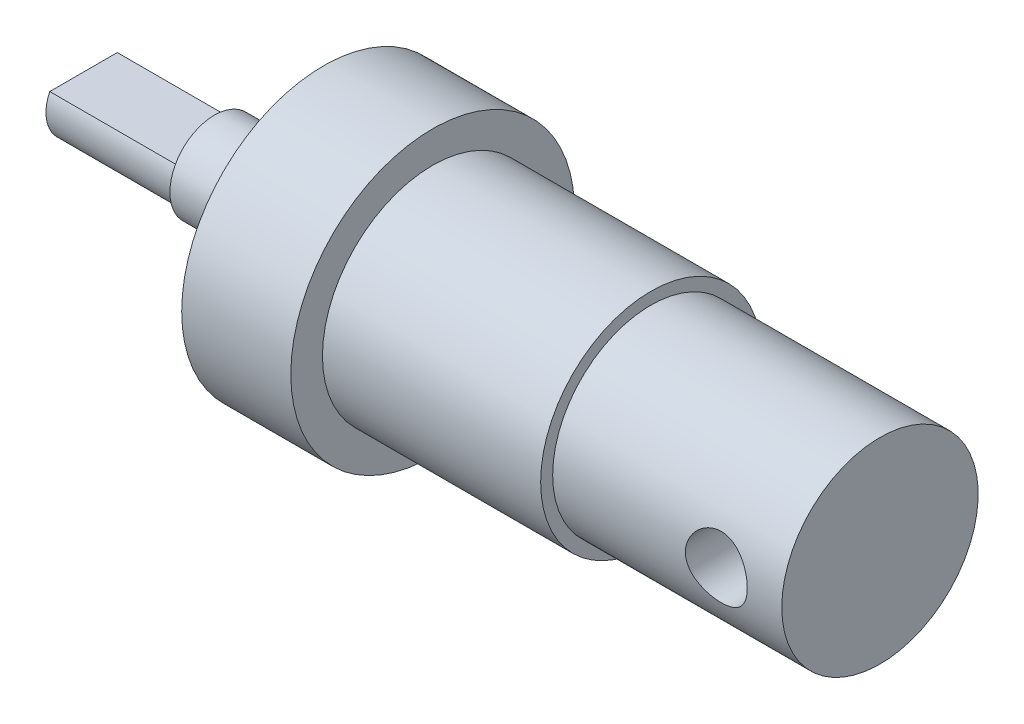
ISO-10303-21;
HEADER;
FILE_DESCRIPTION(('STEP AP214'),'2;1');
FILE_NAME('part.step','',(''),(''),'','','');
FILE_SCHEMA(('AUTOMOTIVE_DESIGN { 1 0 10303 214 1 1 1 1 }'));
ENDSEC;
DATA;
#1=APPLICATION_CONTEXT('core data for automotive mechanical design processes');
#2=APPLICATION_PROTOCOL_DEFINITION('international standard','automotive_design',2000,#1);
#3=PRODUCT_CONTEXT('',#1,'mechanical');
#4=PRODUCT('Part','Part','',(#3));
#5=PRODUCT_RELATED_PRODUCT_CATEGORY('part','',(#4));
#6=PRODUCT_DEFINITION_FORMATION('','',#4);
#7=PRODUCT_DEFINITION_CONTEXT('part definition',#1,'design');
#8=PRODUCT_DEFINITION('design','',#6,#7);
#9=PRODUCT_DEFINITION_SHAPE('','',#8);
#10=(LENGTH_UNIT() NAMED_UNIT(*) SI_UNIT(.MILLI.,.METRE.));
#11=(NAMED_UNIT(*) PLANE_ANGLE_UNIT() SI_UNIT($,.RADIAN.));
#12=(NAMED_UNIT(*) SI_UNIT($,.STERADIAN.) SOLID_ANGLE_UNIT());
#13=UNCERTAINTY_MEASURE_WITH_UNIT(LENGTH_MEASURE(1.E-05),#10,'distance_accuracy_value','');
#14=(GEOMETRIC_REPRESENTATION_CONTEXT(3) GLOBAL_UNCERTAINTY_ASSIGNED_CONTEXT((#13)) GLOBAL_UNIT_ASSIGNED_CONTEXT((#10,
#11,#12)) REPRESENTATION_CONTEXT('',''));
#15=CARTESIAN_POINT('',(0.,0.,0.));
#16=DIRECTION('',(0.,0.,1.));
#17=DIRECTION('',(1.,0.,0.));
#18=AXIS2_PLACEMENT_3D('',#15,#16,#17);
#19=CARTESIAN_POINT('',(-5.,0.,0.));
#20=DIRECTION('',(-1.,0.,0.));
#21=DIRECTION('',(0.,0.,1.));
#22=AXIS2_PLACEMENT_3D('',#19,#20,#21);
#23=CYLINDRICAL_SURFACE('',#22,4.5);
#24=CARTESIAN_POINT('',(16.588256828574,-1.09764286276754,4.36407838447224));
#25=CARTESIAN_POINT('',(16.5270833845499,-1.04617330759767,4.3770231438269));
#26=CARTESIAN_POINT('',(16.4702957225923,-0.989555024817385,4.39029354434856));
#27=CARTESIAN_POINT('',(16.3669482948807,-0.867467578833485,4.41603753323898));
#28=CARTESIAN_POINT('',(16.3203910086217,-0.801996276156327,4.42851092792226));
#29=CARTESIAN_POINT('',(16.2387721071905,-0.663768969664404,4.45132759737578));
#30=CARTESIAN_POINT('',(16.2037254457204,-0.591003648861528,4.46166809482042));
#31=CARTESIAN_POINT('',(16.1463734983666,-0.440249431524472,4.47905430840141));
#32=CARTESIAN_POINT('',(16.1240640621078,-0.362262245779606,4.48610109764383));
#33=CARTESIAN_POINT('',(16.0934520755528,-0.205622706533306,4.49596502276719));
#34=CARTESIAN_POINT('',(16.0847710562777,-0.127051613127193,4.49889619655373));
#35=CARTESIAN_POINT('',(16.08056352236,0.0304814895061291,4.50058568922495));
#36=CARTESIAN_POINT('',(16.0850348574784,0.109443432727423,4.49934469020088));
#37=CARTESIAN_POINT('',(16.106621519285,0.262909411636466,4.49294972792596));
#38=CARTESIAN_POINT('',(16.1233360822228,0.337475597910401,4.48791964963629));
#39=CARTESIAN_POINT('',(16.1683855120653,0.482700819526159,4.47463080465224));
#40=CARTESIAN_POINT('',(16.1967213843163,0.553359516235207,4.46637175862642));
#41=CARTESIAN_POINT('',(16.2647408305174,0.690176756413004,4.44730420264569));
#42=CARTESIAN_POINT('',(16.3046149506909,0.756234477154448,4.43645346687148));
#43=CARTESIAN_POINT('',(16.394395149402,0.880880079855516,4.41339714944489));
#44=CARTESIAN_POINT('',(16.4443038611503,0.939465994504709,4.4011912125469));
#45=CARTESIAN_POINT('',(16.5551388809534,1.0500078547806,4.37616597814393));
#46=CARTESIAN_POINT('',(16.6164312910696,1.10159632464824,4.36334195554905));
#47=CARTESIAN_POINT('',(16.7470058842268,1.19383246764867,4.33901442997745));
#48=CARTESIAN_POINT('',(16.8162884792733,1.234479576241,4.32751099515655));
#49=CARTESIAN_POINT('',(16.9613224490413,1.30374405651637,4.30715291598078));
#50=CARTESIAN_POINT('',(17.0370963466137,1.33231731944445,4.29830801730032));
#51=CARTESIAN_POINT('',(17.1927202408564,1.37620178670478,4.28446101595956));
#52=CARTESIAN_POINT('',(17.2725687020976,1.39151794823268,4.27945747698815));
#53=CARTESIAN_POINT('',(17.4303964139966,1.40793522697943,4.2740834338695));
#54=CARTESIAN_POINT('',(17.5083090176739,1.40961767642176,4.27352348052725));
#55=CARTESIAN_POINT('',(17.6632707119512,1.40023003273705,4.27660843959136));
#56=CARTESIAN_POINT('',(17.7403198817229,1.38916111865765,4.28025296323317));
#57=CARTESIAN_POINT('',(17.8897042210857,1.3550556783883,4.29116900724109));
#58=CARTESIAN_POINT('',(17.9621047143719,1.332277976861,4.29836195578642));
#59=CARTESIAN_POINT('',(18.1020808586957,1.27564264822176,4.31550767501424));
#60=CARTESIAN_POINT('',(18.1696555977164,1.24178293344075,4.32546096564581));
#61=CARTESIAN_POINT('',(18.3006113476724,1.16258163146239,4.34742970657724));
#62=CARTESIAN_POINT('',(18.3637667613169,1.11688372289622,4.35950452940484));
#63=CARTESIAN_POINT('',(18.4817081607143,1.01582716673405,4.38415284376729));
#64=CARTESIAN_POINT('',(18.5364921167669,0.960466183226663,4.39672645530803));
#65=CARTESIAN_POINT('',(18.6381589197758,0.839245617278976,4.42149568907948));
#66=CARTESIAN_POINT('',(18.6846828995163,0.773077955951485,4.43366103644533));
#67=CARTESIAN_POINT('',(18.7659336186728,0.633510958829209,4.45574319712107));
#68=CARTESIAN_POINT('',(18.8006617615522,0.560112484694877,4.46566027788202));
#69=CARTESIAN_POINT('',(18.856723172855,0.409325980989382,4.48197576080136));
#70=CARTESIAN_POINT('',(18.8782602159385,0.332019723059085,4.48842749224505));
#71=CARTESIAN_POINT('',(18.9080072619068,0.174666450378519,4.49729836197749));
#72=CARTESIAN_POINT('',(18.9162211751872,0.0946202468596981,4.4997186835079));
#73=CARTESIAN_POINT('',(18.9189677122617,-0.0624690592487289,4.50022444837237));
#74=CARTESIAN_POINT('',(18.9140400035918,-0.139502745729366,4.49848118168211));
#75=CARTESIAN_POINT('',(18.8918393346655,-0.291577914190268,4.49118897160743));
#76=CARTESIAN_POINT('',(18.8745665348833,-0.366619422053783,4.48564007769251));
#77=CARTESIAN_POINT('',(18.8283623435738,-0.512403733563475,4.47133029815602));
#78=CARTESIAN_POINT('',(18.7994700183276,-0.583160036425868,4.46258018424648));
#79=CARTESIAN_POINT('',(18.7309179231091,-0.718889807190914,4.44273655396938));
#80=CARTESIAN_POINT('',(18.6912558688062,-0.783862044368446,4.43164254055617));
#81=CARTESIAN_POINT('',(18.6004720769187,-0.90892482746428,4.40772841402676));
#82=CARTESIAN_POINT('',(18.5489615032798,-0.968723499325894,4.39485762762571));
#83=CARTESIAN_POINT('',(18.4367601561955,-1.078995404383,4.3690939522649));
#84=CARTESIAN_POINT('',(18.3760671902416,-1.1294664039697,4.35620105875541));
#85=CARTESIAN_POINT('',(18.2451941530672,-1.22100274011996,4.33145091084048));
#86=CARTESIAN_POINT('',(18.1748004678941,-1.26177398226855,4.31963149603054));
#87=CARTESIAN_POINT('',(18.0277261878037,-1.33079279652204,4.29887170933553));
#88=CARTESIAN_POINT('',(17.9510472930591,-1.35904374225341,4.28993056207168));
#89=CARTESIAN_POINT('',(17.7959681334656,-1.40134834975203,4.27629589201585));
#90=CARTESIAN_POINT('',(17.7176871590608,-1.41579980305004,4.27148378935246));
#91=CARTESIAN_POINT('',(17.5596727817714,-1.43136336966998,4.26629471944701));
#92=CARTESIAN_POINT('',(17.4799398077428,-1.43247935969269,4.26591646325925));
#93=CARTESIAN_POINT('',(17.3250789671269,-1.42158811888939,4.26955654197089));
#94=CARTESIAN_POINT('',(17.2499044229051,-1.41016452676373,4.27337935274072));
#95=CARTESIAN_POINT('',(17.1026141962774,-1.3755392767566,4.28464929525765));
#96=CARTESIAN_POINT('',(17.0304984441961,-1.35233788731417,4.2920963444011));
#97=CARTESIAN_POINT('',(16.893185222985,-1.29575485674209,4.30950850340981));
#98=CARTESIAN_POINT('',(16.827848431618,-1.26268519899504,4.31939503191314));
#99=CARTESIAN_POINT('',(16.7032152476673,-1.18704724766282,4.34079035515485));
#100=CARTESIAN_POINT('',(16.6439203841792,-1.1444765582031,4.35229955881305));
#101=CARTESIAN_POINT('',(16.588256828574,-1.09764286276754,4.36407838447224));
#102=B_SPLINE_CURVE_WITH_KNOTS('',3,(#24,#25,#26,#27,#28,#29,#30,#31,#32,#33,#34,#35,#36,#37,
#38,#39,#40,#41,#42,#43,#44,#45,#46,#47,#48,#49,#50,#51,#52,#53,#54,#55,#56,#57,#58,#59,#60,#61,
#62,#63,#64,#65,#66,#67,#68,#69,#70,#71,#72,#73,#74,#75,#76,#77,#78,#79,#80,#81,#82,#83,#84,#85,
#86,#87,#88,#89,#90,#91,#92,#93,#94,#95,#96,#97,#98,#99,#100,#101),.UNSPECIFIED.,.T.,.F.,(4,2,2,
2,2,2,2,2,2,2,2,2,2,2,2,2,2,2,2,2,2,2,2,2,2,2,2,2,2,2,2,2,2,2,2,2,2,2,4),(0.,0.242702533584567,
0.485463825285499,0.728539257342805,0.971535438950307,1.20765594384168,1.44373784824706,
1.67241894871094,1.90111983629102,2.13383711020089,2.36661553211963,2.60888006148042,
2.85115708854776,3.09431171777218,3.33737538545051,3.57001737109382,3.80263784735339,
4.0303242169466,4.25805350361953,4.49365186103091,4.72930725008102,4.97351432446402,
5.21769233300958,5.45799633849311,5.69822980095238,5.92875137489625,6.15926995233645,
6.38901989196278,6.61881860118457,6.85764091229053,7.0965203380096,7.3419153628579,
7.58724422511599,7.82526619955984,8.06321897787511,8.29054877700683,8.51787339508033,
8.73865998730796,8.95950231830971),.UNSPECIFIED.);
#103=CARTESIAN_POINT('',(16.588256828574,-1.09764286276754,4.36407838447224));
#104=VERTEX_POINT('',#103);
#105=EDGE_CURVE('E91',#104,#104,#102,.T.);
#106=ORIENTED_EDGE('',*,*,#105,.T.);
#107=EDGE_LOOP('',(#106));
#108=FACE_BOUND('',#107,.T.);
#109=CARTESIAN_POINT('',(20.5,0.,0.));
#110=DIRECTION('',(-1.,0.,0.));
#111=DIRECTION('',(0.,0.,1.));
#112=AXIS2_PLACEMENT_3D('',#109,#110,#111);
#113=CIRCLE('',#112,4.5);
#114=CARTESIAN_POINT('',(20.5,0.,4.5));
#115=VERTEX_POINT('',#114);
#116=EDGE_CURVE('E78',#115,#115,#113,.T.);
#117=ORIENTED_EDGE('',*,*,#116,.T.);
#118=EDGE_LOOP('',(#117));
#119=FACE_BOUND('',#118,.T.);
#120=CARTESIAN_POINT('',(10.,0.,0.));
#121=DIRECTION('',(-1.,0.,0.));
#122=DIRECTION('',(0.,0.,1.));
#123=AXIS2_PLACEMENT_3D('',#120,#121,#122);
#124=CIRCLE('',#123,4.5);
#125=CARTESIAN_POINT('',(10.,0.,4.5));
#126=VERTEX_POINT('',#125);
#127=EDGE_CURVE('E117',#126,#126,#124,.T.);
#128=ORIENTED_EDGE('',*,*,#127,.F.);
#129=EDGE_LOOP('',(#128));
#130=FACE_BOUND('',#129,.T.);
#131=CARTESIAN_POINT('',(16.5380390080738,-1.15000654639858,-4.350572944251));
#132=CARTESIAN_POINT('',(16.5988396562903,-1.20312781571059,-4.33653175760877));
#133=CARTESIAN_POINT('',(16.6640952030295,-1.25122898753903,-4.32277496877338));
#134=CARTESIAN_POINT('',(16.8019542248214,-1.33611907722739,-4.29729637605486));
#135=CARTESIAN_POINT('',(16.8745565958856,-1.37290969135075,-4.28557426714226));
#136=CARTESIAN_POINT('',(17.0254457658307,-1.43411761602508,-4.26548401430013));
#137=CARTESIAN_POINT('',(17.1037444915241,-1.45850805849832,-4.25712316150053));
#138=CARTESIAN_POINT('',(17.2636448639279,-1.49389201104003,-4.24483742560101));
#139=CARTESIAN_POINT('',(17.3452454438687,-1.504889812881,-4.24091112144587));
#140=CARTESIAN_POINT('',(17.5061580155133,-1.5128992881907,-4.23805987132111));
#141=CARTESIAN_POINT('',(17.5854419259637,-1.5104170501978,-4.23895394207542));
#142=CARTESIAN_POINT('',(17.7423913256221,-1.49273270034516,-4.24521316942359));
#143=CARTESIAN_POINT('',(17.8200568249584,-1.47753066811229,-4.25057829802828));
#144=CARTESIAN_POINT('',(17.9705787251869,-1.43525184769364,-4.26503667023593));
#145=CARTESIAN_POINT('',(18.0434851591471,-1.40833483547954,-4.27407964799084));
#146=CARTESIAN_POINT('',(18.1838111126746,-1.34350856820952,-4.2948968301067));
#147=CARTESIAN_POINT('',(18.2512293839887,-1.3055968213565,-4.30667165347971));
#148=CARTESIAN_POINT('',(18.3819328219342,-1.21785996866901,-4.33231956957801));
#149=CARTESIAN_POINT('',(18.4448963202271,-1.1675762364774,-4.34626315441587));
#150=CARTESIAN_POINT('',(18.5616929917308,-1.05737225430357,-4.37437926523118));
#151=CARTESIAN_POINT('',(18.6155238861328,-0.997449606420628,-4.3885518473857));
#152=CARTESIAN_POINT('',(18.7144059317459,-0.867132969146684,-4.41618190885194));
#153=CARTESIAN_POINT('',(18.7590843676215,-0.796446147571748,-4.42959706868594));
#154=CARTESIAN_POINT('',(18.8358342541774,-0.648102478297907,-4.45371758702122));
#155=CARTESIAN_POINT('',(18.8679081156449,-0.570446966944213,-4.46442346356825));
#156=CARTESIAN_POINT('',(18.9176848506066,-0.41235647336254,-4.48175457862457));
#157=CARTESIAN_POINT('',(18.9357244910769,-0.332038231612042,-4.48847445829572));
#158=CARTESIAN_POINT('',(18.9580230373535,-0.169277461005923,-4.49755261610232));
#159=CARTESIAN_POINT('',(18.9622861390937,-0.0868355866595316,-4.49991222215685));
#160=CARTESIAN_POINT('',(18.9569743587064,0.073997450723559,-4.50007929710386));
#161=CARTESIAN_POINT('',(18.947993386838,0.152408813312954,-4.49808032700807));
#162=CARTESIAN_POINT('',(18.917586524,0.30657121563003,-4.49020857208875));
#163=CARTESIAN_POINT('',(18.8961605032106,0.382322227597664,-4.48433574685522));
#164=CARTESIAN_POINT('',(18.8415549815971,0.529201310223197,-4.46938553869545));
#165=CARTESIAN_POINT('',(18.8083627689288,0.600324282135094,-4.46030468995239));
#166=CARTESIAN_POINT('',(18.7312193975721,0.736123139693359,-4.43991487432775));
#167=CARTESIAN_POINT('',(18.6872657367632,0.80079752106386,-4.4286053893904));
#168=CARTESIAN_POINT('',(18.5876671850072,0.924796802829211,-4.40441965514291));
#169=CARTESIAN_POINT('',(18.5316048944265,0.983777649900602,-4.39149725267683));
#170=CARTESIAN_POINT('',(18.4104418825284,1.09167729862862,-4.36592741212696));
#171=CARTESIAN_POINT('',(18.3453392447065,1.14059396126186,-4.3532800330059));
#172=CARTESIAN_POINT('',(18.2060162264319,1.228105572802,-4.32941908656565));
#173=CARTESIAN_POINT('',(18.1316140097056,1.26642354592331,-4.31824738940904));
#174=CARTESIAN_POINT('',(17.9770046358206,1.3298902435334,-4.2991277744522));
#175=CARTESIAN_POINT('',(17.8967992507862,1.35504296916069,-4.29117887735494));
#176=CARTESIAN_POINT('',(17.7356551190021,1.39065011863879,-4.27977028921809));
#177=CARTESIAN_POINT('',(17.654827266842,1.40156078662261,-4.27617153902094));
#178=CARTESIAN_POINT('',(17.4924178855048,1.40976206646939,-4.27347546037303));
#179=CARTESIAN_POINT('',(17.4108365436152,1.40705597656324,-4.2743770418582));
#180=CARTESIAN_POINT('',(17.2525332934141,1.3885067958519,-4.28043619050029));
#181=CARTESIAN_POINT('',(17.1757448550602,1.37317000653626,-4.28542969509521));
#182=CARTESIAN_POINT('',(17.0258769874089,1.33055461898547,-4.29885088981683));
#183=CARTESIAN_POINT('',(16.9527980392354,1.30327447608166,-4.30727902414443));
#184=CARTESIAN_POINT('',(16.8108203309642,1.2369873084396,-4.32678550364665));
#185=CARTESIAN_POINT('',(16.7420289901806,1.19776484815543,-4.33791169911247));
#186=CARTESIAN_POINT('',(16.6118068312919,1.10887583791017,-4.36147958669007));
#187=CARTESIAN_POINT('',(16.5503780069981,1.05920646885388,-4.37392163343242));
#188=CARTESIAN_POINT('',(16.4336885793645,0.948141141062849,-4.39936517710429));
#189=CARTESIAN_POINT('',(16.3788385156505,0.886312792612338,-4.4123662382327));
#190=CARTESIAN_POINT('',(16.2802080542319,0.75410534768408,-4.43687261745295));
#191=CARTESIAN_POINT('',(16.2364279967761,0.68372598847998,-4.44837788956479));
#192=CARTESIAN_POINT('',(16.1611971574693,0.53611304837285,-4.46857185324819));
#193=CARTESIAN_POINT('',(16.1297674671199,0.458868015928004,-4.47725572219055));
#194=CARTESIAN_POINT('',(16.0804606209595,0.299847867721547,-4.49070671177476));
#195=CARTESIAN_POINT('',(16.0625789132605,0.218074283392906,-4.49547514797947));
#196=CARTESIAN_POINT('',(16.0415124808396,0.0561007883647794,-4.50034835120317));
#197=CARTESIAN_POINT('',(16.0377294032548,-0.0240158206556514,-4.50064466004347));
#198=CARTESIAN_POINT('',(16.0433268327284,-0.183679511531178,-4.49695850133299));
#199=CARTESIAN_POINT('',(16.0527055404023,-0.263226669743229,-4.49297661868323));
#200=CARTESIAN_POINT('',(16.0839080825948,-0.417719155721959,-4.48122615255189));
#201=CARTESIAN_POINT('',(16.1054566959177,-0.49272695166344,-4.47354184521748));
#202=CARTESIAN_POINT('',(16.160064067598,-0.638031452975403,-4.45514145264556));
#203=CARTESIAN_POINT('',(16.1931254366125,-0.708327085490511,-4.44442467986311));
#204=CARTESIAN_POINT('',(16.2717645306896,-0.845985205692363,-4.42034411866261));
#205=CARTESIAN_POINT('',(16.3178984490477,-0.913010989238563,-4.40687255313094));
#206=CARTESIAN_POINT('',(16.4205386738743,-1.03837859992938,-4.3790297156002));
#207=CARTESIAN_POINT('',(16.4770473762564,-1.09671841552177,-4.36465823628463));
#208=CARTESIAN_POINT('',(16.5380390080738,-1.15000654639858,-4.350572944251));
#209=B_SPLINE_CURVE_WITH_KNOTS('',3,(#131,#132,#133,#134,#135,#136,#137,#138,#139,#140,#141,
#142,#143,#144,#145,#146,#147,#148,#149,#150,#151,#152,#153,#154,#155,#156,#157,#158,#159,#160,
#161,#162,#163,#164,#165,#166,#167,#168,#169,#170,#171,#172,#173,#174,#175,#176,#177,#178,#179,
#180,#181,#182,#183,#184,#185,#186,#187,#188,#189,#190,#191,#192,#193,#194,#195,#196,#197,#198,
#199,#200,#201,#202,#203,#204,#205,#206,#207,#208),.UNSPECIFIED.,.T.,.F.,(4,2,2,2,2,2,2,2,2,2,2,
2,2,2,2,2,2,2,2,2,2,2,2,2,2,2,2,2,2,2,2,2,2,2,2,2,2,2,4),(0.,0.245572905237851,
0.491108963506395,0.73717479368322,0.983161749444172,1.21997886451829,1.45679449711065,
1.69047682558643,1.92421215621509,2.16844624151571,2.41274117986602,2.66557634417378,
2.91836312693611,3.16487895434109,3.41131969309778,3.64703980561415,3.88276237707628,
4.11874039626769,4.35477333437697,4.60083511054641,4.84694913033403,5.0989908330661,
5.35095589157437,5.59463331704048,5.83825172216388,6.07255442481337,6.30688743946924,
6.54572702060687,6.78463113541378,7.03446043477486,7.2842974119823,7.53455921634114,
7.78473689972675,8.02416747701856,8.2635653242725,8.49775435043548,8.73199651642045,
8.97828385317594,9.22462813831062),.UNSPECIFIED.);
#210=CARTESIAN_POINT('',(16.5380390080738,-1.15000654639858,-4.350572944251));
#211=VERTEX_POINT('',#210);
#212=EDGE_CURVE('E96',#211,#211,#209,.T.);
#213=ORIENTED_EDGE('',*,*,#212,.T.);
#214=EDGE_LOOP('',(#213));
#215=FACE_BOUND('',#214,.T.);
#216=ADVANCED_FACE('F45',(#108,#119,#130,#215),#23,.T.);
#217=CARTESIAN_POINT('',(-5.,0.,0.));
#218=DIRECTION('',(1.,0.,0.));
#219=DIRECTION('',(0.,0.,-1.));
#220=AXIS2_PLACEMENT_3D('',#217,#218,#219);
#221=PLANE('',#220);
#222=CARTESIAN_POINT('',(-5.,0.,0.));
#223=DIRECTION('',(1.,0.,0.));
#224=DIRECTION('',(0.,0.,-1.));
#225=AXIS2_PLACEMENT_3D('',#222,#223,#224);
#226=CIRCLE('',#225,2.04);
#227=CARTESIAN_POINT('',(-5.,0.,-2.04));
#228=VERTEX_POINT('',#227);
#229=EDGE_CURVE('E11',#228,#228,#226,.F.);
#230=ORIENTED_EDGE('',*,*,#229,.F.);
#231=EDGE_LOOP('',(#230));
#232=FACE_BOUND('',#231,.T.);
#233=CARTESIAN_POINT('',(-5.,0.,0.));
#234=DIRECTION('',(-1.,0.,0.));
#235=DIRECTION('',(0.,0.,1.));
#236=AXIS2_PLACEMENT_3D('',#233,#234,#235);
#237=CIRCLE('',#236,6.5);
#238=CARTESIAN_POINT('',(-5.,0.,6.5));
#239=VERTEX_POINT('',#238);
#240=EDGE_CURVE('E101',#239,#239,#237,.T.);
#241=ORIENTED_EDGE('',*,*,#240,.T.);
#242=EDGE_LOOP('',(#241));
#243=FACE_BOUND('',#242,.T.);
#244=ADVANCED_FACE('F47',(#232,#243),#221,.F.);
#245=CARTESIAN_POINT('',(20.5,0.,0.));
#246=DIRECTION('',(-1.,0.,0.));
#247=DIRECTION('',(0.,0.,1.));
#248=AXIS2_PLACEMENT_3D('',#245,#246,#247);
#249=PLANE('',#248);
#250=ORIENTED_EDGE('',*,*,#116,.F.);
#251=EDGE_LOOP('',(#250));
#252=FACE_BOUND('',#251,.T.);
#253=ADVANCED_FACE('F156',(#252),#249,.F.);
#254=CARTESIAN_POINT('',(10.,0.,0.));
#255=DIRECTION('',(1.,0.,0.));
#256=DIRECTION('',(0.,0.,-1.));
#257=AXIS2_PLACEMENT_3D('',#254,#255,#256);
#258=PLANE('',#257);
#259=ORIENTED_EDGE('',*,*,#127,.T.);
#260=EDGE_LOOP('',(#259));
#261=FACE_BOUND('',#260,.T.);
#262=CARTESIAN_POINT('',(10.,0.,0.));
#263=DIRECTION('',(-1.,0.,0.));
#264=DIRECTION('',(0.,0.,1.));
#265=AXIS2_PLACEMENT_3D('',#262,#263,#264);
#266=CIRCLE('',#265,5.05);
#267=CARTESIAN_POINT('',(10.,0.,5.05));
#268=VERTEX_POINT('',#267);
#269=EDGE_CURVE('E113',#268,#268,#266,.T.);
#270=ORIENTED_EDGE('',*,*,#269,.F.);
#271=EDGE_LOOP('',(#270));
#272=FACE_BOUND('',#271,.T.);
#273=ADVANCED_FACE('F153',(#261,#272),#258,.T.);
#274=CARTESIAN_POINT('',(-5.,0.,0.));
#275=DIRECTION('',(-1.,0.,0.));
#276=DIRECTION('',(0.,0.,1.));
#277=AXIS2_PLACEMENT_3D('',#274,#275,#276);
#278=CYLINDRICAL_SURFACE('',#277,5.05);
#279=CARTESIAN_POINT('',(0.,0.,0.));
#280=DIRECTION('',(-1.,0.,0.));
#281=DIRECTION('',(0.,0.,1.));
#282=AXIS2_PLACEMENT_3D('',#279,#280,#281);
#283=CIRCLE('',#282,5.05);
#284=CARTESIAN_POINT('',(0.,0.,5.05));
#285=VERTEX_POINT('',#284);
#286=EDGE_CURVE('E109',#285,#285,#283,.T.);
#287=ORIENTED_EDGE('',*,*,#286,.F.);
#288=EDGE_LOOP('',(#287));
#289=FACE_BOUND('',#288,.T.);
#290=ORIENTED_EDGE('',*,*,#269,.T.);
#291=EDGE_LOOP('',(#290));
#292=FACE_BOUND('',#291,.T.);
#293=ADVANCED_FACE('F150',(#289,#292),#278,.T.);
#294=CARTESIAN_POINT('',(0.,0.,0.));
#295=DIRECTION('',(-1.,0.,0.));
#296=DIRECTION('',(0.,0.,1.));
#297=AXIS2_PLACEMENT_3D('',#294,#295,#296);
#298=PLANE('',#297);
#299=CARTESIAN_POINT('',(0.,0.,0.));
#300=DIRECTION('',(-1.,0.,0.));
#301=DIRECTION('',(0.,0.,1.));
#302=AXIS2_PLACEMENT_3D('',#299,#300,#301);
#303=CIRCLE('',#302,6.5);
#304=CARTESIAN_POINT('',(0.,0.,6.5));
#305=VERTEX_POINT('',#304);
#306=EDGE_CURVE('E105',#305,#305,#303,.T.);
#307=ORIENTED_EDGE('',*,*,#306,.F.);
#308=EDGE_LOOP('',(#307));
#309=FACE_BOUND('',#308,.T.);
#310=ORIENTED_EDGE('',*,*,#286,.T.);
#311=EDGE_LOOP('',(#310));
#312=FACE_BOUND('',#311,.T.);
#313=ADVANCED_FACE('F146',(#309,#312),#298,.F.);
#314=CARTESIAN_POINT('',(-5.,0.,0.));
#315=DIRECTION('',(-1.,0.,0.));
#316=DIRECTION('',(0.,0.,1.));
#317=AXIS2_PLACEMENT_3D('',#314,#315,#316);
#318=CYLINDRICAL_SURFACE('',#317,6.5);
#319=ORIENTED_EDGE('',*,*,#240,.F.);
#320=EDGE_LOOP('',(#319));
#321=FACE_BOUND('',#320,.T.);
#322=ORIENTED_EDGE('',*,*,#306,.T.);
#323=EDGE_LOOP('',(#322));
#324=FACE_BOUND('',#323,.T.);
#325=ADVANCED_FACE('F140',(#321,#324),#318,.T.);
#326=CARTESIAN_POINT('',(17.5,-0.0674472883090074,-7.59299035054011));
#327=DIRECTION('',(0.,-0.0047252868789963,-0.999988835769636));
#328=DIRECTION('',(0.,0.999988835769636,-0.0047252868789963));
#329=AXIS2_PLACEMENT_3D('',#326,#327,#328);
#330=CONICAL_SURFACE('',#329,1.47498353276021,0.00472530446380527);
#331=ORIENTED_EDGE('',*,*,#212,.F.);
#332=EDGE_LOOP('',(#331));
#333=FACE_BOUND('',#332,.T.);
#334=ORIENTED_EDGE('',*,*,#105,.F.);
#335=EDGE_LOOP('',(#334));
#336=FACE_BOUND('',#335,.T.);
#337=ADVANCED_FACE('F134',(#333,#336),#330,.F.);
#338=CARTESIAN_POINT('',(-10.,0.,0.));
#339=DIRECTION('',(1.,0.,0.));
#340=DIRECTION('',(0.,0.,-1.));
#341=AXIS2_PLACEMENT_3D('',#338,#339,#340);
#342=CYLINDRICAL_SURFACE('',#341,2.04);
#343=CARTESIAN_POINT('',(-10.,0.,0.));
#344=DIRECTION('',(-1.,0.,0.));
#345=DIRECTION('',(0.,0.,1.));
#346=AXIS2_PLACEMENT_3D('',#343,#344,#345);
#347=CIRCLE('',#346,2.04);
#348=CARTESIAN_POINT('',(-10.,0.,2.04));
#349=VERTEX_POINT('',#348);
#350=EDGE_CURVE('E87',#349,#349,#347,.T.);
#351=ORIENTED_EDGE('',*,*,#350,.F.);
#352=EDGE_LOOP('',(#351));
#353=FACE_BOUND('',#352,.T.);
#354=ORIENTED_EDGE('',*,*,#229,.T.);
#355=EDGE_LOOP('',(#354));
#356=FACE_BOUND('',#355,.T.);
#357=ADVANCED_FACE('F139',(#353,#356),#342,.T.);
#358=CARTESIAN_POINT('',(-10.,0.,0.));
#359=DIRECTION('',(-1.,0.,0.));
#360=DIRECTION('',(0.,0.,1.));
#361=AXIS2_PLACEMENT_3D('',#358,#359,#360);
#362=PLANE('',#361);
#363=DIRECTION('',(0.,0.,-1.));
#364=VECTOR('',#363,1.);
#365=CARTESIAN_POINT('',(-10.,0.75,0.));
#366=LINE('',#365,#364);
#367=CARTESIAN_POINT('',(-10.,0.75,1.5478695035435));
#368=VERTEX_POINT('',#367);
#369=CARTESIAN_POINT('',(-10.,0.75,-1.5478695035435));
#370=VERTEX_POINT('',#369);
#371=EDGE_CURVE('E60',#368,#370,#366,.T.);
#372=ORIENTED_EDGE('',*,*,#371,.F.);
#373=CARTESIAN_POINT('',(-10.,0.,0.));
#374=DIRECTION('',(-1.,0.,0.));
#375=DIRECTION('',(0.,0.,1.));
#376=AXIS2_PLACEMENT_3D('',#373,#374,#375);
#377=CIRCLE('',#376,1.72);
#378=EDGE_CURVE('E54',#370,#368,#377,.T.);
#379=ORIENTED_EDGE('',*,*,#378,.F.);
#380=EDGE_LOOP('',(#372,#379));
#381=FACE_BOUND('',#380,.T.);
#382=ORIENTED_EDGE('',*,*,#350,.T.);
#383=EDGE_LOOP('',(#382));
#384=FACE_BOUND('',#383,.T.);
#385=ADVANCED_FACE('F72',(#381,#384),#362,.T.);
#386=CARTESIAN_POINT('',(-16.,0.,0.));
#387=DIRECTION('',(-1.,0.,0.));
#388=DIRECTION('',(0.,0.,1.));
#389=AXIS2_PLACEMENT_3D('',#386,#387,#388);
#390=PLANE('',#389);
#391=DIRECTION('',(0.,0.,-1.));
#392=VECTOR('',#391,1.);
#393=CARTESIAN_POINT('',(-16.,0.75,0.));
#394=LINE('',#393,#392);
#395=CARTESIAN_POINT('',(-16.,0.75,1.5478695035435));
#396=VERTEX_POINT('',#395);
#397=CARTESIAN_POINT('',(-16.,0.75,-1.5478695035435));
#398=VERTEX_POINT('',#397);
#399=EDGE_CURVE('E86',#396,#398,#394,.T.);
#400=ORIENTED_EDGE('',*,*,#399,.T.);
#401=CARTESIAN_POINT('',(-16.,0.,0.));
#402=DIRECTION('',(-1.,0.,0.));
#403=DIRECTION('',(0.,0.,1.));
#404=AXIS2_PLACEMENT_3D('',#401,#402,#403);
#405=CIRCLE('',#404,1.72);
#406=EDGE_CURVE('E67',#398,#396,#405,.T.);
#407=ORIENTED_EDGE('',*,*,#406,.T.);
#408=EDGE_LOOP('',(#400,#407));
#409=FACE_BOUND('',#408,.T.);
#410=ADVANCED_FACE('F197',(#409),#390,.T.);
#411=CARTESIAN_POINT('',(-16.,0.,0.));
#412=DIRECTION('',(1.,0.,0.));
#413=DIRECTION('',(0.,0.,-1.));
#414=AXIS2_PLACEMENT_3D('',#411,#412,#413);
#415=CYLINDRICAL_SURFACE('',#414,1.72);
#416=DIRECTION('',(1.,0.,0.));
#417=VECTOR('',#416,1.);
#418=CARTESIAN_POINT('',(-16.,0.75,-1.5478695035435));
#419=LINE('',#418,#417);
#420=EDGE_CURVE('E83',#398,#370,#419,.T.);
#421=ORIENTED_EDGE('',*,*,#420,.T.);
#422=ORIENTED_EDGE('',*,*,#378,.T.);
#423=DIRECTION('',(1.,0.,0.));
#424=VECTOR('',#423,1.);
#425=CARTESIAN_POINT('',(-16.,0.75,1.5478695035435));
#426=LINE('',#425,#424);
#427=EDGE_CURVE('E84',#396,#368,#426,.T.);
#428=ORIENTED_EDGE('',*,*,#427,.F.);
#429=ORIENTED_EDGE('',*,*,#406,.F.);
#430=EDGE_LOOP('',(#421,#422,#428,#429));
#431=FACE_BOUND('',#430,.T.);
#432=ADVANCED_FACE('F89',(#431),#415,.T.);
#433=CARTESIAN_POINT('',(-16.,0.75,0.));
#434=DIRECTION('',(0.,-1.,0.));
#435=DIRECTION('',(0.,0.,-1.));
#436=AXIS2_PLACEMENT_3D('',#433,#434,#435);
#437=PLANE('',#436);
#438=ORIENTED_EDGE('',*,*,#427,.T.);
#439=ORIENTED_EDGE('',*,*,#371,.T.);
#440=ORIENTED_EDGE('',*,*,#420,.F.);
#441=ORIENTED_EDGE('',*,*,#399,.F.);
#442=EDGE_LOOP('',(#438,#439,#440,#441));
#443=FACE_BOUND('',#442,.T.);
#444=ADVANCED_FACE('F81',(#443),#437,.F.);
#445=CLOSED_SHELL('',(#216,#244,#253,#273,#293,#313,#325,#337,#357,#385,#410,#432,#444));
#446=MANIFOLD_SOLID_BREP('B2',#445);
#447=ADVANCED_BREP_SHAPE_REPRESENTATION('',(#18,#446),#14);
#448=SHAPE_DEFINITION_REPRESENTATION(#9,#447);
ENDSEC;
END-ISO-10303-21;
